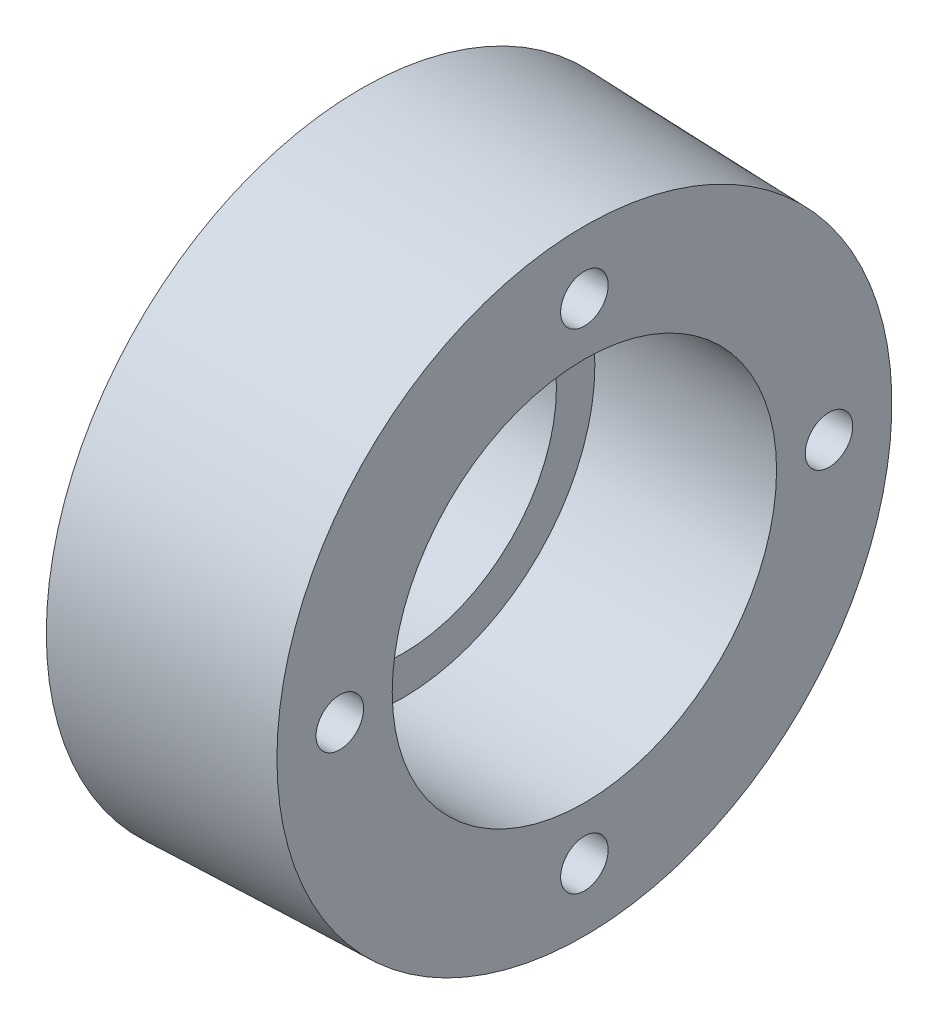
ISO-10303-21;
HEADER;
FILE_DESCRIPTION(('STEP AP214'),'2;1');
FILE_NAME('part.step','',(''),(''),'','','');
FILE_SCHEMA(('AUTOMOTIVE_DESIGN { 1 0 10303 214 1 1 1 1 }'));
ENDSEC;
DATA;
#1=APPLICATION_CONTEXT('core data for automotive mechanical design processes');
#2=APPLICATION_PROTOCOL_DEFINITION('international standard','automotive_design',2000,#1);
#3=PRODUCT_CONTEXT('',#1,'mechanical');
#4=PRODUCT('Part','Part','',(#3));
#5=PRODUCT_RELATED_PRODUCT_CATEGORY('part','',(#4));
#6=PRODUCT_DEFINITION_FORMATION('','',#4);
#7=PRODUCT_DEFINITION_CONTEXT('part definition',#1,'design');
#8=PRODUCT_DEFINITION('design','',#6,#7);
#9=PRODUCT_DEFINITION_SHAPE('','',#8);
#10=(LENGTH_UNIT() NAMED_UNIT(*) SI_UNIT(.MILLI.,.METRE.));
#11=(NAMED_UNIT(*) PLANE_ANGLE_UNIT() SI_UNIT($,.RADIAN.));
#12=(NAMED_UNIT(*) SI_UNIT($,.STERADIAN.) SOLID_ANGLE_UNIT());
#13=UNCERTAINTY_MEASURE_WITH_UNIT(LENGTH_MEASURE(1.E-05),#10,'distance_accuracy_value','');
#14=(GEOMETRIC_REPRESENTATION_CONTEXT(3) GLOBAL_UNCERTAINTY_ASSIGNED_CONTEXT((#13)) GLOBAL_UNIT_ASSIGNED_CONTEXT((#10,
#11,#12)) REPRESENTATION_CONTEXT('',''));
#15=CARTESIAN_POINT('',(0.,0.,0.));
#16=DIRECTION('',(0.,0.,1.));
#17=DIRECTION('',(1.,0.,0.));
#18=AXIS2_PLACEMENT_3D('',#15,#16,#17);
#19=CARTESIAN_POINT('',(0.,22.,0.));
#20=DIRECTION('',(1.,0.,0.));
#21=DIRECTION('',(0.,0.,-1.));
#22=AXIS2_PLACEMENT_3D('',#19,#20,#21);
#23=PLANE('',#22);
#24=CARTESIAN_POINT('',(0.,0.,0.));
#25=DIRECTION('',(-1.,0.,0.));
#26=DIRECTION('',(0.,0.,1.));
#27=AXIS2_PLACEMENT_3D('',#24,#25,#26);
#28=CIRCLE('',#27,22.);
#29=CARTESIAN_POINT('',(0.,0.,22.));
#30=VERTEX_POINT('',#29);
#31=EDGE_CURVE('E107',#30,#30,#28,.T.);
#32=ORIENTED_EDGE('',*,*,#31,.F.);
#33=EDGE_LOOP('',(#32));
#34=FACE_BOUND('',#33,.T.);
#35=CARTESIAN_POINT('',(0.,0.,0.));
#36=DIRECTION('',(-1.,0.,0.));
#37=DIRECTION('',(0.,0.,1.));
#38=AXIS2_PLACEMENT_3D('',#35,#36,#37);
#39=CIRCLE('',#38,28.);
#40=CARTESIAN_POINT('',(0.,0.,28.));
#41=VERTEX_POINT('',#40);
#42=EDGE_CURVE('E11',#41,#41,#39,.T.);
#43=ORIENTED_EDGE('',*,*,#42,.T.);
#44=EDGE_LOOP('',(#43));
#45=FACE_BOUND('',#44,.T.);
#46=ADVANCED_FACE('F45',(#34,#45),#23,.F.);
#47=CARTESIAN_POINT('',(0.,0.,0.));
#48=DIRECTION('',(-1.,0.,0.));
#49=DIRECTION('',(0.,0.,1.));
#50=AXIS2_PLACEMENT_3D('',#47,#48,#49);
#51=CYLINDRICAL_SURFACE('',#50,28.);
#52=ORIENTED_EDGE('',*,*,#42,.F.);
#53=EDGE_LOOP('',(#52));
#54=FACE_BOUND('',#53,.T.);
#55=CARTESIAN_POINT('',(5.,0.,0.));
#56=DIRECTION('',(-1.,0.,0.));
#57=DIRECTION('',(0.,0.,1.));
#58=AXIS2_PLACEMENT_3D('',#55,#56,#57);
#59=CIRCLE('',#58,28.);
#60=CARTESIAN_POINT('',(5.,0.,28.));
#61=VERTEX_POINT('',#60);
#62=EDGE_CURVE('E53',#61,#61,#59,.T.);
#63=ORIENTED_EDGE('',*,*,#62,.T.);
#64=EDGE_LOOP('',(#63));
#65=FACE_BOUND('',#64,.T.);
#66=ADVANCED_FACE('F134',(#54,#65),#51,.T.);
#67=CARTESIAN_POINT('',(5.,28.,0.));
#68=DIRECTION('',(1.,0.,0.));
#69=DIRECTION('',(0.,0.,-1.));
#70=AXIS2_PLACEMENT_3D('',#67,#68,#69);
#71=PLANE('',#70);
#72=ORIENTED_EDGE('',*,*,#62,.F.);
#73=EDGE_LOOP('',(#72));
#74=FACE_BOUND('',#73,.T.);
#75=CARTESIAN_POINT('',(5.,0.,0.));
#76=DIRECTION('',(-1.,0.,0.));
#77=DIRECTION('',(0.,0.,1.));
#78=AXIS2_PLACEMENT_3D('',#75,#76,#77);
#79=CIRCLE('',#78,45.);
#80=CARTESIAN_POINT('',(5.,0.,45.));
#81=VERTEX_POINT('',#80);
#82=EDGE_CURVE('E127',#81,#81,#79,.T.);
#83=ORIENTED_EDGE('',*,*,#82,.T.);
#84=EDGE_LOOP('',(#83));
#85=FACE_BOUND('',#84,.T.);
#86=ADVANCED_FACE('F136',(#74,#85),#71,.F.);
#87=CARTESIAN_POINT('',(37.,0.,0.));
#88=DIRECTION('',(-1.,0.,0.));
#89=DIRECTION('',(0.,0.,1.));
#90=AXIS2_PLACEMENT_3D('',#87,#88,#89);
#91=CONICAL_SURFACE('',#90,44.,0.0312398334302683);
#92=ORIENTED_EDGE('',*,*,#82,.F.);
#93=EDGE_LOOP('',(#92));
#94=FACE_BOUND('',#93,.T.);
#95=CARTESIAN_POINT('',(37.,0.,0.));
#96=DIRECTION('',(-1.,0.,0.));
#97=DIRECTION('',(0.,0.,1.));
#98=AXIS2_PLACEMENT_3D('',#95,#96,#97);
#99=CIRCLE('',#98,44.);
#100=CARTESIAN_POINT('',(37.,0.,44.));
#101=VERTEX_POINT('',#100);
#102=EDGE_CURVE('E123',#101,#101,#99,.T.);
#103=ORIENTED_EDGE('',*,*,#102,.T.);
#104=EDGE_LOOP('',(#103));
#105=FACE_BOUND('',#104,.T.);
#106=ADVANCED_FACE('F139',(#94,#105),#91,.T.);
#107=CARTESIAN_POINT('',(37.,44.,0.));
#108=DIRECTION('',(-1.,0.,0.));
#109=DIRECTION('',(0.,0.,1.));
#110=AXIS2_PLACEMENT_3D('',#107,#108,#109);
#111=PLANE('',#110);
#112=CARTESIAN_POINT('',(37.,3.66605540578529E-13,35.));
#113=DIRECTION('',(1.,0.,0.));
#114=DIRECTION('',(0.,0.,-1.));
#115=AXIS2_PLACEMENT_3D('',#112,#113,#114);
#116=CIRCLE('',#115,3.39999999999999);
#117=CARTESIAN_POINT('',(37.,3.66605540578529E-13,31.6));
#118=VERTEX_POINT('',#117);
#119=EDGE_CURVE('E78',#118,#118,#116,.T.);
#120=ORIENTED_EDGE('',*,*,#119,.F.);
#121=EDGE_LOOP('',(#120));
#122=FACE_BOUND('',#121,.T.);
#123=CARTESIAN_POINT('',(37.,-35.,0.));
#124=DIRECTION('',(1.,0.,0.));
#125=DIRECTION('',(0.,0.,-1.));
#126=AXIS2_PLACEMENT_3D('',#123,#124,#125);
#127=CIRCLE('',#126,3.39999999999999);
#128=CARTESIAN_POINT('',(37.,-35.,-3.39999999999999));
#129=VERTEX_POINT('',#128);
#130=EDGE_CURVE('E77',#129,#129,#127,.T.);
#131=ORIENTED_EDGE('',*,*,#130,.F.);
#132=EDGE_LOOP('',(#131));
#133=FACE_BOUND('',#132,.T.);
#134=CARTESIAN_POINT('',(37.,-1.2220184685951E-13,-35.));
#135=DIRECTION('',(1.,0.,0.));
#136=DIRECTION('',(0.,0.,-1.));
#137=AXIS2_PLACEMENT_3D('',#134,#135,#136);
#138=CIRCLE('',#137,3.39999999999999);
#139=CARTESIAN_POINT('',(37.,-1.2220184685951E-13,-38.4));
#140=VERTEX_POINT('',#139);
#141=EDGE_CURVE('E91',#140,#140,#138,.T.);
#142=ORIENTED_EDGE('',*,*,#141,.F.);
#143=EDGE_LOOP('',(#142));
#144=FACE_BOUND('',#143,.T.);
#145=CARTESIAN_POINT('',(37.,35.,0.));
#146=DIRECTION('',(1.,0.,0.));
#147=DIRECTION('',(0.,0.,-1.));
#148=AXIS2_PLACEMENT_3D('',#145,#146,#147);
#149=CIRCLE('',#148,3.39999999999999);
#150=CARTESIAN_POINT('',(37.,35.,-3.39999999999999));
#151=VERTEX_POINT('',#150);
#152=EDGE_CURVE('E99',#151,#151,#149,.T.);
#153=ORIENTED_EDGE('',*,*,#152,.F.);
#154=EDGE_LOOP('',(#153));
#155=FACE_BOUND('',#154,.T.);
#156=ORIENTED_EDGE('',*,*,#102,.F.);
#157=EDGE_LOOP('',(#156));
#158=FACE_BOUND('',#157,.T.);
#159=CARTESIAN_POINT('',(37.,0.,0.));
#160=DIRECTION('',(-1.,0.,0.));
#161=DIRECTION('',(0.,0.,1.));
#162=AXIS2_PLACEMENT_3D('',#159,#160,#161);
#163=CIRCLE('',#162,27.5);
#164=CARTESIAN_POINT('',(37.,0.,27.5));
#165=VERTEX_POINT('',#164);
#166=EDGE_CURVE('E119',#165,#165,#163,.T.);
#167=ORIENTED_EDGE('',*,*,#166,.T.);
#168=EDGE_LOOP('',(#167));
#169=FACE_BOUND('',#168,.T.);
#170=ADVANCED_FACE('F145',(#122,#133,#144,#155,#158,#169),#111,.F.);
#171=CARTESIAN_POINT('',(0.,0.,0.));
#172=DIRECTION('',(-1.,0.,0.));
#173=DIRECTION('',(0.,0.,1.));
#174=AXIS2_PLACEMENT_3D('',#171,#172,#173);
#175=CYLINDRICAL_SURFACE('',#174,27.5);
#176=ORIENTED_EDGE('',*,*,#166,.F.);
#177=EDGE_LOOP('',(#176));
#178=FACE_BOUND('',#177,.T.);
#179=CARTESIAN_POINT('',(11.,0.,0.));
#180=DIRECTION('',(-1.,0.,0.));
#181=DIRECTION('',(0.,0.,1.));
#182=AXIS2_PLACEMENT_3D('',#179,#180,#181);
#183=CIRCLE('',#182,27.5);
#184=CARTESIAN_POINT('',(11.,0.,27.5));
#185=VERTEX_POINT('',#184);
#186=EDGE_CURVE('E115',#185,#185,#183,.T.);
#187=ORIENTED_EDGE('',*,*,#186,.T.);
#188=EDGE_LOOP('',(#187));
#189=FACE_BOUND('',#188,.T.);
#190=ADVANCED_FACE('F151',(#178,#189),#175,.F.);
#191=CARTESIAN_POINT('',(11.,27.5,0.));
#192=DIRECTION('',(-1.,0.,0.));
#193=DIRECTION('',(0.,0.,1.));
#194=AXIS2_PLACEMENT_3D('',#191,#192,#193);
#195=PLANE('',#194);
#196=ORIENTED_EDGE('',*,*,#186,.F.);
#197=EDGE_LOOP('',(#196));
#198=FACE_BOUND('',#197,.T.);
#199=CARTESIAN_POINT('',(11.,0.,0.));
#200=DIRECTION('',(-1.,0.,0.));
#201=DIRECTION('',(0.,0.,1.));
#202=AXIS2_PLACEMENT_3D('',#199,#200,#201);
#203=CIRCLE('',#202,22.);
#204=CARTESIAN_POINT('',(11.,0.,22.));
#205=VERTEX_POINT('',#204);
#206=EDGE_CURVE('E111',#205,#205,#203,.T.);
#207=ORIENTED_EDGE('',*,*,#206,.T.);
#208=EDGE_LOOP('',(#207));
#209=FACE_BOUND('',#208,.T.);
#210=ADVANCED_FACE('F158',(#198,#209),#195,.F.);
#211=CARTESIAN_POINT('',(0.,0.,0.));
#212=DIRECTION('',(-1.,0.,0.));
#213=DIRECTION('',(0.,0.,1.));
#214=AXIS2_PLACEMENT_3D('',#211,#212,#213);
#215=CYLINDRICAL_SURFACE('',#214,22.);
#216=ORIENTED_EDGE('',*,*,#206,.F.);
#217=EDGE_LOOP('',(#216));
#218=FACE_BOUND('',#217,.T.);
#219=ORIENTED_EDGE('',*,*,#31,.T.);
#220=EDGE_LOOP('',(#219));
#221=FACE_BOUND('',#220,.T.);
#222=ADVANCED_FACE('F164',(#218,#221),#215,.F.);
#223=CARTESIAN_POINT('',(14.75,35.,0.));
#224=DIRECTION('',(1.,0.,0.));
#225=DIRECTION('',(0.,0.,-1.));
#226=AXIS2_PLACEMENT_3D('',#223,#224,#225);
#227=CONICAL_SURFACE('',#226,3.39999999999999,1.02974425867665);
#228=CARTESIAN_POINT('',(12.7070738953063,35.,0.));
#229=VERTEX_POINT('',#228);
#230=VERTEX_LOOP('',#229);
#231=FACE_BOUND('',#230,.T.);
#232=CARTESIAN_POINT('',(14.75,35.,0.));
#233=DIRECTION('',(1.,0.,0.));
#234=DIRECTION('',(0.,0.,-1.));
#235=AXIS2_PLACEMENT_3D('',#232,#233,#234);
#236=CIRCLE('',#235,3.39999999999999);
#237=CARTESIAN_POINT('',(14.75,35.,-3.39999999999999));
#238=VERTEX_POINT('',#237);
#239=EDGE_CURVE('E103',#238,#238,#236,.T.);
#240=ORIENTED_EDGE('',*,*,#239,.T.);
#241=EDGE_LOOP('',(#240));
#242=FACE_BOUND('',#241,.T.);
#243=ADVANCED_FACE('F170',(#231,#242),#227,.F.);
#244=CARTESIAN_POINT('',(37.,35.,0.));
#245=DIRECTION('',(1.,0.,0.));
#246=DIRECTION('',(0.,0.,-1.));
#247=AXIS2_PLACEMENT_3D('',#244,#245,#246);
#248=CYLINDRICAL_SURFACE('',#247,3.39999999999999);
#249=ORIENTED_EDGE('',*,*,#239,.F.);
#250=EDGE_LOOP('',(#249));
#251=FACE_BOUND('',#250,.T.);
#252=ORIENTED_EDGE('',*,*,#152,.T.);
#253=EDGE_LOOP('',(#252));
#254=FACE_BOUND('',#253,.T.);
#255=ADVANCED_FACE('F184',(#251,#254),#248,.F.);
#256=CARTESIAN_POINT('',(14.75,-1.2220184685951E-13,-35.));
#257=DIRECTION('',(1.,0.,0.));
#258=DIRECTION('',(0.,0.,-1.));
#259=AXIS2_PLACEMENT_3D('',#256,#257,#258);
#260=CONICAL_SURFACE('',#259,3.39999999999999,1.02974425867665);
#261=CARTESIAN_POINT('',(12.7070738953063,-1.28151897698717E-13,-35.));
#262=VERTEX_POINT('',#261);
#263=VERTEX_LOOP('',#262);
#264=FACE_BOUND('',#263,.T.);
#265=CARTESIAN_POINT('',(14.75,-1.2220184685951E-13,-35.));
#266=DIRECTION('',(1.,0.,0.));
#267=DIRECTION('',(0.,0.,-1.));
#268=AXIS2_PLACEMENT_3D('',#265,#266,#267);
#269=CIRCLE('',#268,3.39999999999999);
#270=CARTESIAN_POINT('',(14.75,-1.2220184685951E-13,-38.4));
#271=VERTEX_POINT('',#270);
#272=EDGE_CURVE('E95',#271,#271,#269,.T.);
#273=ORIENTED_EDGE('',*,*,#272,.T.);
#274=EDGE_LOOP('',(#273));
#275=FACE_BOUND('',#274,.T.);
#276=ADVANCED_FACE('F187',(#264,#275),#260,.F.);
#277=CARTESIAN_POINT('',(37.,-1.2220184685951E-13,-35.));
#278=DIRECTION('',(1.,0.,0.));
#279=DIRECTION('',(0.,0.,-1.));
#280=AXIS2_PLACEMENT_3D('',#277,#278,#279);
#281=CYLINDRICAL_SURFACE('',#280,3.39999999999999);
#282=ORIENTED_EDGE('',*,*,#272,.F.);
#283=EDGE_LOOP('',(#282));
#284=FACE_BOUND('',#283,.T.);
#285=ORIENTED_EDGE('',*,*,#141,.T.);
#286=EDGE_LOOP('',(#285));
#287=FACE_BOUND('',#286,.T.);
#288=ADVANCED_FACE('F191',(#284,#287),#281,.F.);
#289=CARTESIAN_POINT('',(14.75,-35.,0.));
#290=DIRECTION('',(1.,0.,0.));
#291=DIRECTION('',(0.,0.,-1.));
#292=AXIS2_PLACEMENT_3D('',#289,#290,#291);
#293=CONICAL_SURFACE('',#292,3.39999999999999,1.02974425867665);
#294=CARTESIAN_POINT('',(12.7070738953063,-35.,0.));
#295=VERTEX_POINT('',#294);
#296=VERTEX_LOOP('',#295);
#297=FACE_BOUND('',#296,.T.);
#298=CARTESIAN_POINT('',(14.75,-35.,0.));
#299=DIRECTION('',(1.,0.,0.));
#300=DIRECTION('',(0.,0.,-1.));
#301=AXIS2_PLACEMENT_3D('',#298,#299,#300);
#302=CIRCLE('',#301,3.39999999999999);
#303=CARTESIAN_POINT('',(14.75,-35.,-3.39999999999999));
#304=VERTEX_POINT('',#303);
#305=EDGE_CURVE('E83',#304,#304,#302,.T.);
#306=ORIENTED_EDGE('',*,*,#305,.T.);
#307=EDGE_LOOP('',(#306));
#308=FACE_BOUND('',#307,.T.);
#309=ADVANCED_FACE('F194',(#297,#308),#293,.F.);
#310=CARTESIAN_POINT('',(37.,-35.,0.));
#311=DIRECTION('',(1.,0.,0.));
#312=DIRECTION('',(0.,0.,-1.));
#313=AXIS2_PLACEMENT_3D('',#310,#311,#312);
#314=CYLINDRICAL_SURFACE('',#313,3.39999999999999);
#315=ORIENTED_EDGE('',*,*,#305,.F.);
#316=EDGE_LOOP('',(#315));
#317=FACE_BOUND('',#316,.T.);
#318=ORIENTED_EDGE('',*,*,#130,.T.);
#319=EDGE_LOOP('',(#318));
#320=FACE_BOUND('',#319,.T.);
#321=ADVANCED_FACE('F70',(#317,#320),#314,.F.);
#322=CARTESIAN_POINT('',(14.75,3.66605540578529E-13,35.));
#323=DIRECTION('',(1.,0.,0.));
#324=DIRECTION('',(0.,0.,-1.));
#325=AXIS2_PLACEMENT_3D('',#322,#323,#324);
#326=CONICAL_SURFACE('',#325,3.39999999999999,1.02974425867665);
#327=CARTESIAN_POINT('',(12.7070738953063,3.60655489739322E-13,35.));
#328=VERTEX_POINT('',#327);
#329=VERTEX_LOOP('',#328);
#330=FACE_BOUND('',#329,.T.);
#331=CARTESIAN_POINT('',(14.75,3.66605540578529E-13,35.));
#332=DIRECTION('',(1.,0.,0.));
#333=DIRECTION('',(0.,0.,-1.));
#334=AXIS2_PLACEMENT_3D('',#331,#332,#333);
#335=CIRCLE('',#334,3.39999999999999);
#336=CARTESIAN_POINT('',(14.75,3.66605540578529E-13,31.6));
#337=VERTEX_POINT('',#336);
#338=EDGE_CURVE('E74',#337,#337,#335,.T.);
#339=ORIENTED_EDGE('',*,*,#338,.T.);
#340=EDGE_LOOP('',(#339));
#341=FACE_BOUND('',#340,.T.);
#342=ADVANCED_FACE('F66',(#330,#341),#326,.F.);
#343=CARTESIAN_POINT('',(37.,3.66605540578529E-13,35.));
#344=DIRECTION('',(1.,0.,0.));
#345=DIRECTION('',(0.,0.,-1.));
#346=AXIS2_PLACEMENT_3D('',#343,#344,#345);
#347=CYLINDRICAL_SURFACE('',#346,3.39999999999999);
#348=ORIENTED_EDGE('',*,*,#338,.F.);
#349=EDGE_LOOP('',(#348));
#350=FACE_BOUND('',#349,.T.);
#351=ORIENTED_EDGE('',*,*,#119,.T.);
#352=EDGE_LOOP('',(#351));
#353=FACE_BOUND('',#352,.T.);
#354=ADVANCED_FACE('F69',(#350,#353),#347,.F.);
#355=CLOSED_SHELL('',(#46,#66,#86,#106,#170,#190,#210,#222,#243,#255,#276,#288,#309,#321,#342,#354));
#356=MANIFOLD_SOLID_BREP('B2',#355);
#357=ADVANCED_BREP_SHAPE_REPRESENTATION('',(#18,#356),#14);
#358=SHAPE_DEFINITION_REPRESENTATION(#9,#357);
ENDSEC;
END-ISO-10303-21;
